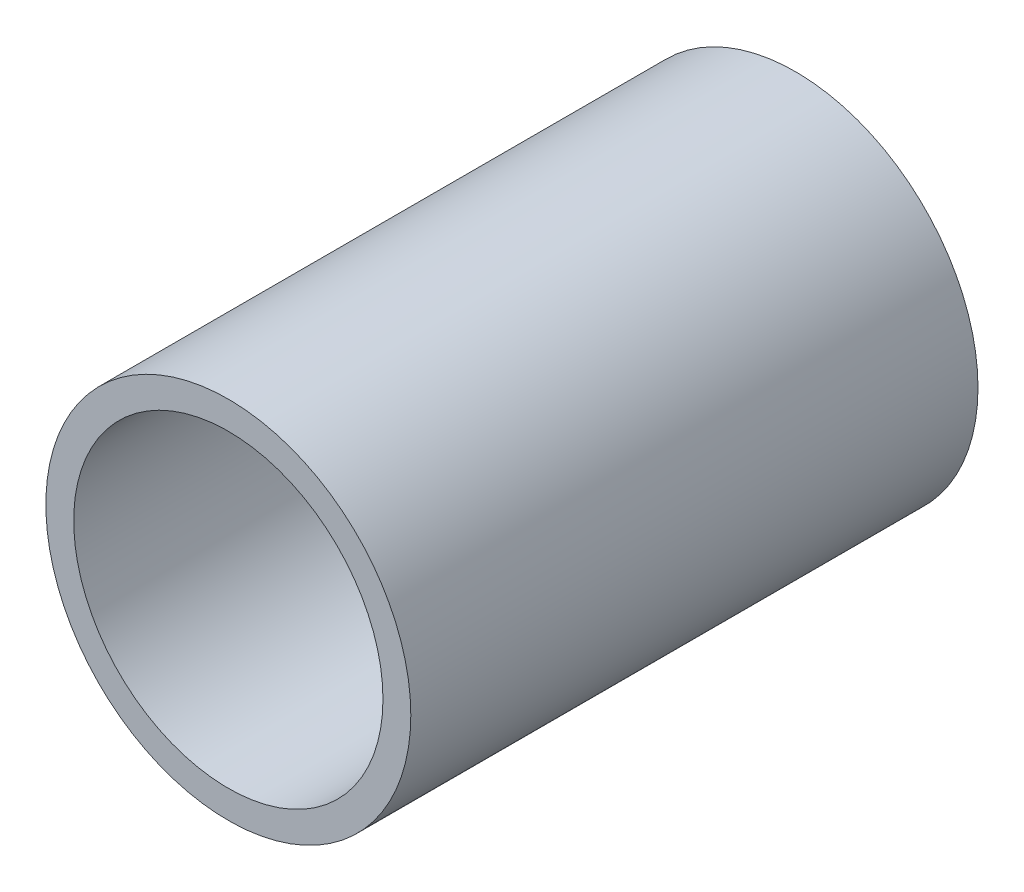
ISO-10303-21;
HEADER;
FILE_DESCRIPTION(('STEP AP214'),'2;1');
FILE_NAME('part.step','',(''),(''),'','','');
FILE_SCHEMA(('AUTOMOTIVE_DESIGN { 1 0 10303 214 1 1 1 1 }'));
ENDSEC;
DATA;
#1=APPLICATION_CONTEXT('core data for automotive mechanical design processes');
#2=APPLICATION_PROTOCOL_DEFINITION('international standard','automotive_design',2000,#1);
#3=PRODUCT_CONTEXT('',#1,'mechanical');
#4=PRODUCT('Part','Part','',(#3));
#5=PRODUCT_RELATED_PRODUCT_CATEGORY('part','',(#4));
#6=PRODUCT_DEFINITION_FORMATION('','',#4);
#7=PRODUCT_DEFINITION_CONTEXT('part definition',#1,'design');
#8=PRODUCT_DEFINITION('design','',#6,#7);
#9=PRODUCT_DEFINITION_SHAPE('','',#8);
#10=(LENGTH_UNIT() NAMED_UNIT(*) SI_UNIT(.MILLI.,.METRE.));
#11=(NAMED_UNIT(*) PLANE_ANGLE_UNIT() SI_UNIT($,.RADIAN.));
#12=(NAMED_UNIT(*) SI_UNIT($,.STERADIAN.) SOLID_ANGLE_UNIT());
#13=UNCERTAINTY_MEASURE_WITH_UNIT(LENGTH_MEASURE(1.E-05),#10,'distance_accuracy_value','');
#14=(GEOMETRIC_REPRESENTATION_CONTEXT(3) GLOBAL_UNCERTAINTY_ASSIGNED_CONTEXT((#13)) GLOBAL_UNIT_ASSIGNED_CONTEXT((#10,
#11,#12)) REPRESENTATION_CONTEXT('',''));
#15=CARTESIAN_POINT('',(0.,0.,0.));
#16=DIRECTION('',(0.,0.,1.));
#17=DIRECTION('',(1.,0.,0.));
#18=AXIS2_PLACEMENT_3D('',#15,#16,#17);
#19=CARTESIAN_POINT('',(0.,0.,37.5));
#20=DIRECTION('',(0.,0.,1.));
#21=DIRECTION('',(1.,0.,0.));
#22=AXIS2_PLACEMENT_3D('',#19,#20,#21);
#23=PLANE('',#22);
#24=CARTESIAN_POINT('',(0.,0.,37.5));
#25=DIRECTION('',(0.,0.,1.));
#26=DIRECTION('',(1.,0.,0.));
#27=AXIS2_PLACEMENT_3D('',#24,#25,#26);
#28=CIRCLE('',#27,24.13);
#29=CARTESIAN_POINT('',(24.13,0.,37.5));
#30=VERTEX_POINT('',#29);
#31=EDGE_CURVE('E10',#30,#30,#28,.T.);
#32=ORIENTED_EDGE('',*,*,#31,.T.);
#33=EDGE_LOOP('',(#32));
#34=FACE_BOUND('',#33,.T.);
#35=CARTESIAN_POINT('',(0.,0.,37.5));
#36=DIRECTION('',(0.,0.,1.));
#37=DIRECTION('',(1.,0.,0.));
#38=AXIS2_PLACEMENT_3D('',#35,#36,#37);
#39=CIRCLE('',#38,20.447);
#40=CARTESIAN_POINT('',(20.447,0.,37.5));
#41=VERTEX_POINT('',#40);
#42=EDGE_CURVE('E50',#41,#41,#39,.T.);
#43=ORIENTED_EDGE('',*,*,#42,.F.);
#44=EDGE_LOOP('',(#43));
#45=FACE_BOUND('',#44,.T.);
#46=ADVANCED_FACE('F39',(#34,#45),#23,.T.);
#47=CARTESIAN_POINT('',(0.,0.,-37.5));
#48=DIRECTION('',(0.,0.,1.));
#49=DIRECTION('',(1.,0.,0.));
#50=AXIS2_PLACEMENT_3D('',#47,#48,#49);
#51=PLANE('',#50);
#52=CARTESIAN_POINT('',(0.,0.,-37.5));
#53=DIRECTION('',(0.,0.,1.));
#54=DIRECTION('',(1.,0.,0.));
#55=AXIS2_PLACEMENT_3D('',#52,#53,#54);
#56=CIRCLE('',#55,24.13);
#57=CARTESIAN_POINT('',(24.13,0.,-37.5));
#58=VERTEX_POINT('',#57);
#59=EDGE_CURVE('E43',#58,#58,#56,.T.);
#60=ORIENTED_EDGE('',*,*,#59,.F.);
#61=EDGE_LOOP('',(#60));
#62=FACE_BOUND('',#61,.T.);
#63=CARTESIAN_POINT('',(0.,0.,-37.5));
#64=DIRECTION('',(0.,0.,1.));
#65=DIRECTION('',(1.,0.,0.));
#66=AXIS2_PLACEMENT_3D('',#63,#64,#65);
#67=CIRCLE('',#66,20.447);
#68=CARTESIAN_POINT('',(20.447,0.,-37.5));
#69=VERTEX_POINT('',#68);
#70=EDGE_CURVE('E52',#69,#69,#67,.T.);
#71=ORIENTED_EDGE('',*,*,#70,.T.);
#72=EDGE_LOOP('',(#71));
#73=FACE_BOUND('',#72,.T.);
#74=ADVANCED_FACE('F62',(#62,#73),#51,.F.);
#75=CARTESIAN_POINT('',(0.,0.,37.5));
#76=DIRECTION('',(0.,0.,-1.));
#77=DIRECTION('',(-1.,0.,0.));
#78=AXIS2_PLACEMENT_3D('',#75,#76,#77);
#79=CYLINDRICAL_SURFACE('',#78,24.13);
#80=ORIENTED_EDGE('',*,*,#31,.F.);
#81=EDGE_LOOP('',(#80));
#82=FACE_BOUND('',#81,.T.);
#83=ORIENTED_EDGE('',*,*,#59,.T.);
#84=EDGE_LOOP('',(#83));
#85=FACE_BOUND('',#84,.T.);
#86=ADVANCED_FACE('F41',(#82,#85),#79,.T.);
#87=CARTESIAN_POINT('',(0.,0.,37.5));
#88=DIRECTION('',(0.,0.,-1.));
#89=DIRECTION('',(-1.,0.,0.));
#90=AXIS2_PLACEMENT_3D('',#87,#88,#89);
#91=CYLINDRICAL_SURFACE('',#90,20.447);
#92=ORIENTED_EDGE('',*,*,#42,.T.);
#93=EDGE_LOOP('',(#92));
#94=FACE_BOUND('',#93,.T.);
#95=ORIENTED_EDGE('',*,*,#70,.F.);
#96=EDGE_LOOP('',(#95));
#97=FACE_BOUND('',#96,.T.);
#98=ADVANCED_FACE('F58',(#94,#97),#91,.F.);
#99=CLOSED_SHELL('',(#46,#74,#86,#98));
#100=MANIFOLD_SOLID_BREP('B2',#99);
#101=ADVANCED_BREP_SHAPE_REPRESENTATION('',(#18,#100),#14);
#102=SHAPE_DEFINITION_REPRESENTATION(#9,#101);
ENDSEC;
END-ISO-10303-21;
